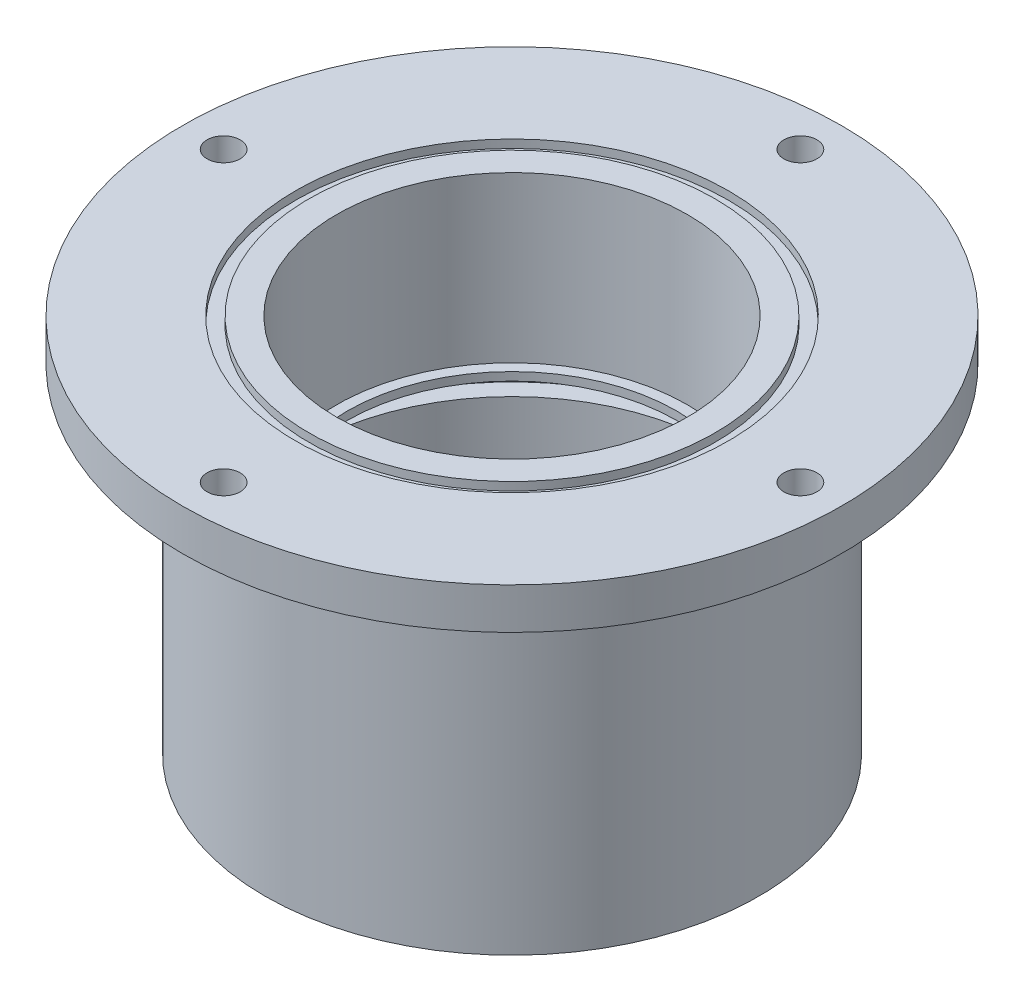
ISO-10303-21;
HEADER;
FILE_DESCRIPTION(('STEP AP214'),'2;1');
FILE_NAME('part.step','',(''),(''),'','','');
FILE_SCHEMA(('AUTOMOTIVE_DESIGN { 1 0 10303 214 1 1 1 1 }'));
ENDSEC;
DATA;
#1=APPLICATION_CONTEXT('core data for automotive mechanical design processes');
#2=APPLICATION_PROTOCOL_DEFINITION('international standard','automotive_design',2000,#1);
#3=PRODUCT_CONTEXT('',#1,'mechanical');
#4=PRODUCT('Part','Part','',(#3));
#5=PRODUCT_RELATED_PRODUCT_CATEGORY('part','',(#4));
#6=PRODUCT_DEFINITION_FORMATION('','',#4);
#7=PRODUCT_DEFINITION_CONTEXT('part definition',#1,'design');
#8=PRODUCT_DEFINITION('design','',#6,#7);
#9=PRODUCT_DEFINITION_SHAPE('','',#8);
#10=(LENGTH_UNIT() NAMED_UNIT(*) SI_UNIT(.MILLI.,.METRE.));
#11=(NAMED_UNIT(*) PLANE_ANGLE_UNIT() SI_UNIT($,.RADIAN.));
#12=(NAMED_UNIT(*) SI_UNIT($,.STERADIAN.) SOLID_ANGLE_UNIT());
#13=UNCERTAINTY_MEASURE_WITH_UNIT(LENGTH_MEASURE(1.E-05),#10,'distance_accuracy_value','');
#14=(GEOMETRIC_REPRESENTATION_CONTEXT(3) GLOBAL_UNCERTAINTY_ASSIGNED_CONTEXT((#13)) GLOBAL_UNIT_ASSIGNED_CONTEXT((#10,
#11,#12)) REPRESENTATION_CONTEXT('',''));
#15=CARTESIAN_POINT('',(0.,0.,0.));
#16=DIRECTION('',(0.,0.,1.));
#17=DIRECTION('',(1.,0.,0.));
#18=AXIS2_PLACEMENT_3D('',#15,#16,#17);
#19=CARTESIAN_POINT('',(0.,0.,0.));
#20=DIRECTION('',(0.,-1.,0.));
#21=DIRECTION('',(0.,0.,-1.));
#22=AXIS2_PLACEMENT_3D('',#19,#20,#21);
#23=CYLINDRICAL_SURFACE('',#22,38.1);
#24=CARTESIAN_POINT('',(0.,52.07,0.));
#25=DIRECTION('',(0.,-1.,0.));
#26=DIRECTION('',(0.,0.,-1.));
#27=AXIS2_PLACEMENT_3D('',#24,#25,#26);
#28=CIRCLE('',#27,38.1);
#29=CARTESIAN_POINT('',(0.,52.07,-38.1));
#30=VERTEX_POINT('',#29);
#31=EDGE_CURVE('E107',#30,#30,#28,.T.);
#32=ORIENTED_EDGE('',*,*,#31,.T.);
#33=EDGE_LOOP('',(#32));
#34=FACE_BOUND('',#33,.T.);
#35=CARTESIAN_POINT('',(0.,0.,0.));
#36=DIRECTION('',(0.,-1.,0.));
#37=DIRECTION('',(0.,0.,-1.));
#38=AXIS2_PLACEMENT_3D('',#35,#36,#37);
#39=CIRCLE('',#38,38.1);
#40=CARTESIAN_POINT('',(0.,0.,-38.1));
#41=VERTEX_POINT('',#40);
#42=EDGE_CURVE('E10',#41,#41,#39,.T.);
#43=ORIENTED_EDGE('',*,*,#42,.F.);
#44=EDGE_LOOP('',(#43));
#45=FACE_BOUND('',#44,.T.);
#46=ADVANCED_FACE('F37',(#34,#45),#23,.T.);
#47=CARTESIAN_POINT('',(31.8135,0.,0.));
#48=DIRECTION('',(0.,-1.,0.));
#49=DIRECTION('',(0.,0.,-1.));
#50=AXIS2_PLACEMENT_3D('',#47,#48,#49);
#51=PLANE('',#50);
#52=ORIENTED_EDGE('',*,*,#42,.T.);
#53=EDGE_LOOP('',(#52));
#54=FACE_BOUND('',#53,.T.);
#55=CARTESIAN_POINT('',(0.,0.,0.));
#56=DIRECTION('',(0.,-1.,0.));
#57=DIRECTION('',(0.,0.,-1.));
#58=AXIS2_PLACEMENT_3D('',#55,#56,#57);
#59=CIRCLE('',#58,31.8135);
#60=CARTESIAN_POINT('',(0.,0.,-31.8135));
#61=VERTEX_POINT('',#60);
#62=EDGE_CURVE('E43',#61,#61,#59,.T.);
#63=ORIENTED_EDGE('',*,*,#62,.F.);
#64=EDGE_LOOP('',(#63));
#65=FACE_BOUND('',#64,.T.);
#66=ADVANCED_FACE('F169',(#54,#65),#51,.T.);
#67=CARTESIAN_POINT('',(0.,0.,0.));
#68=DIRECTION('',(0.,-1.,0.));
#69=DIRECTION('',(0.,0.,-1.));
#70=AXIS2_PLACEMENT_3D('',#67,#68,#69);
#71=CYLINDRICAL_SURFACE('',#70,31.8135);
#72=ORIENTED_EDGE('',*,*,#62,.T.);
#73=EDGE_LOOP('',(#72));
#74=FACE_BOUND('',#73,.T.);
#75=CARTESIAN_POINT('',(0.,2.54,0.));
#76=DIRECTION('',(0.,-1.,0.));
#77=DIRECTION('',(0.,0.,-1.));
#78=AXIS2_PLACEMENT_3D('',#75,#76,#77);
#79=CIRCLE('',#78,31.8135);
#80=CARTESIAN_POINT('',(0.,2.54,-31.8135));
#81=VERTEX_POINT('',#80);
#82=EDGE_CURVE('E47',#81,#81,#79,.T.);
#83=ORIENTED_EDGE('',*,*,#82,.F.);
#84=EDGE_LOOP('',(#83));
#85=FACE_BOUND('',#84,.T.);
#86=ADVANCED_FACE('F173',(#74,#85),#71,.F.);
#87=CARTESIAN_POINT('',(31.8135,2.54,0.));
#88=DIRECTION('',(0.,1.,0.));
#89=DIRECTION('',(0.,0.,1.));
#90=AXIS2_PLACEMENT_3D('',#87,#88,#89);
#91=PLANE('',#90);
#92=ORIENTED_EDGE('',*,*,#82,.T.);
#93=EDGE_LOOP('',(#92));
#94=FACE_BOUND('',#93,.T.);
#95=CARTESIAN_POINT('',(0.,2.54,0.));
#96=DIRECTION('',(0.,-1.,0.));
#97=DIRECTION('',(0.,0.,-1.));
#98=AXIS2_PLACEMENT_3D('',#95,#96,#97);
#99=CIRCLE('',#98,33.909);
#100=CARTESIAN_POINT('',(0.,2.54,-33.909));
#101=VERTEX_POINT('',#100);
#102=EDGE_CURVE('E51',#101,#101,#99,.T.);
#103=ORIENTED_EDGE('',*,*,#102,.F.);
#104=EDGE_LOOP('',(#103));
#105=FACE_BOUND('',#104,.T.);
#106=ADVANCED_FACE('F177',(#94,#105),#91,.T.);
#107=CARTESIAN_POINT('',(0.,0.,0.));
#108=DIRECTION('',(0.,-1.,0.));
#109=DIRECTION('',(0.,0.,-1.));
#110=AXIS2_PLACEMENT_3D('',#107,#108,#109);
#111=CYLINDRICAL_SURFACE('',#110,33.909);
#112=ORIENTED_EDGE('',*,*,#102,.T.);
#113=EDGE_LOOP('',(#112));
#114=FACE_BOUND('',#113,.T.);
#115=CARTESIAN_POINT('',(0.,6.096,0.));
#116=DIRECTION('',(0.,-1.,0.));
#117=DIRECTION('',(0.,0.,-1.));
#118=AXIS2_PLACEMENT_3D('',#115,#116,#117);
#119=CIRCLE('',#118,33.909);
#120=CARTESIAN_POINT('',(0.,6.096,-33.909));
#121=VERTEX_POINT('',#120);
#122=EDGE_CURVE('E56',#121,#121,#119,.T.);
#123=ORIENTED_EDGE('',*,*,#122,.F.);
#124=EDGE_LOOP('',(#123));
#125=FACE_BOUND('',#124,.T.);
#126=ADVANCED_FACE('F183',(#114,#125),#111,.F.);
#127=CARTESIAN_POINT('',(33.909,6.096,0.));
#128=DIRECTION('',(0.,-1.,0.));
#129=DIRECTION('',(0.,0.,-1.));
#130=AXIS2_PLACEMENT_3D('',#127,#128,#129);
#131=PLANE('',#130);
#132=ORIENTED_EDGE('',*,*,#122,.T.);
#133=EDGE_LOOP('',(#132));
#134=FACE_BOUND('',#133,.T.);
#135=CARTESIAN_POINT('',(0.,6.096,0.));
#136=DIRECTION('',(0.,-1.,0.));
#137=DIRECTION('',(0.,0.,-1.));
#138=AXIS2_PLACEMENT_3D('',#135,#136,#137);
#139=CIRCLE('',#138,31.8135);
#140=CARTESIAN_POINT('',(0.,6.096,-31.8135));
#141=VERTEX_POINT('',#140);
#142=EDGE_CURVE('E59',#141,#141,#139,.T.);
#143=ORIENTED_EDGE('',*,*,#142,.F.);
#144=EDGE_LOOP('',(#143));
#145=FACE_BOUND('',#144,.T.);
#146=ADVANCED_FACE('F187',(#134,#145),#131,.T.);
#147=CARTESIAN_POINT('',(0.,0.,0.));
#148=DIRECTION('',(0.,-1.,0.));
#149=DIRECTION('',(0.,0.,-1.));
#150=AXIS2_PLACEMENT_3D('',#147,#148,#149);
#151=CYLINDRICAL_SURFACE('',#150,31.8135);
#152=ORIENTED_EDGE('',*,*,#142,.T.);
#153=EDGE_LOOP('',(#152));
#154=FACE_BOUND('',#153,.T.);
#155=CARTESIAN_POINT('',(0.,25.146,0.));
#156=DIRECTION('',(0.,-1.,0.));
#157=DIRECTION('',(0.,0.,-1.));
#158=AXIS2_PLACEMENT_3D('',#155,#156,#157);
#159=CIRCLE('',#158,31.8135);
#160=CARTESIAN_POINT('',(0.,25.146,-31.8135));
#161=VERTEX_POINT('',#160);
#162=EDGE_CURVE('E62',#161,#161,#159,.T.);
#163=ORIENTED_EDGE('',*,*,#162,.F.);
#164=EDGE_LOOP('',(#163));
#165=FACE_BOUND('',#164,.T.);
#166=ADVANCED_FACE('F191',(#154,#165),#151,.F.);
#167=CARTESIAN_POINT('',(31.8135,25.146,0.));
#168=DIRECTION('',(0.,1.,0.));
#169=DIRECTION('',(0.,0.,1.));
#170=AXIS2_PLACEMENT_3D('',#167,#168,#169);
#171=PLANE('',#170);
#172=ORIENTED_EDGE('',*,*,#162,.T.);
#173=EDGE_LOOP('',(#172));
#174=FACE_BOUND('',#173,.T.);
#175=CARTESIAN_POINT('',(0.,25.146,0.));
#176=DIRECTION('',(0.,-1.,0.));
#177=DIRECTION('',(0.,0.,-1.));
#178=AXIS2_PLACEMENT_3D('',#175,#176,#177);
#179=CIRCLE('',#178,34.5829759866241);
#180=CARTESIAN_POINT('',(0.,25.146,-34.5829759866241));
#181=VERTEX_POINT('',#180);
#182=EDGE_CURVE('E65',#181,#181,#179,.T.);
#183=ORIENTED_EDGE('',*,*,#182,.F.);
#184=EDGE_LOOP('',(#183));
#185=FACE_BOUND('',#184,.T.);
#186=ADVANCED_FACE('F195',(#174,#185),#171,.T.);
#187=CARTESIAN_POINT('',(0.,0.,0.));
#188=DIRECTION('',(0.,-1.,0.));
#189=DIRECTION('',(0.,0.,-1.));
#190=AXIS2_PLACEMENT_3D('',#187,#188,#189);
#191=CYLINDRICAL_SURFACE('',#190,34.5829759866241);
#192=ORIENTED_EDGE('',*,*,#182,.T.);
#193=EDGE_LOOP('',(#192));
#194=FACE_BOUND('',#193,.T.);
#195=CARTESIAN_POINT('',(0.,28.702,0.));
#196=DIRECTION('',(0.,-1.,0.));
#197=DIRECTION('',(0.,0.,-1.));
#198=AXIS2_PLACEMENT_3D('',#195,#196,#197);
#199=CIRCLE('',#198,34.5829759866241);
#200=CARTESIAN_POINT('',(0.,28.702,-34.5829759866241));
#201=VERTEX_POINT('',#200);
#202=EDGE_CURVE('E68',#201,#201,#199,.T.);
#203=ORIENTED_EDGE('',*,*,#202,.F.);
#204=EDGE_LOOP('',(#203));
#205=FACE_BOUND('',#204,.T.);
#206=ADVANCED_FACE('F199',(#194,#205),#191,.F.);
#207=CARTESIAN_POINT('',(34.5829759866241,28.702,0.));
#208=DIRECTION('',(0.,-1.,0.));
#209=DIRECTION('',(0.,0.,-1.));
#210=AXIS2_PLACEMENT_3D('',#207,#208,#209);
#211=PLANE('',#210);
#212=ORIENTED_EDGE('',*,*,#202,.T.);
#213=EDGE_LOOP('',(#212));
#214=FACE_BOUND('',#213,.T.);
#215=CARTESIAN_POINT('',(0.,28.702,0.));
#216=DIRECTION('',(0.,-1.,0.));
#217=DIRECTION('',(0.,0.,-1.));
#218=AXIS2_PLACEMENT_3D('',#215,#216,#217);
#219=CIRCLE('',#218,31.8135);
#220=CARTESIAN_POINT('',(0.,28.702,-31.8135));
#221=VERTEX_POINT('',#220);
#222=EDGE_CURVE('E71',#221,#221,#219,.T.);
#223=ORIENTED_EDGE('',*,*,#222,.F.);
#224=EDGE_LOOP('',(#223));
#225=FACE_BOUND('',#224,.T.);
#226=ADVANCED_FACE('F203',(#214,#225),#211,.T.);
#227=CARTESIAN_POINT('',(0.,0.,0.));
#228=DIRECTION('',(0.,-1.,0.));
#229=DIRECTION('',(0.,0.,-1.));
#230=AXIS2_PLACEMENT_3D('',#227,#228,#229);
#231=CYLINDRICAL_SURFACE('',#230,31.8135);
#232=ORIENTED_EDGE('',*,*,#222,.T.);
#233=EDGE_LOOP('',(#232));
#234=FACE_BOUND('',#233,.T.);
#235=CARTESIAN_POINT('',(0.,31.75,0.));
#236=DIRECTION('',(0.,-1.,0.));
#237=DIRECTION('',(0.,0.,-1.));
#238=AXIS2_PLACEMENT_3D('',#235,#236,#237);
#239=CIRCLE('',#238,31.8135);
#240=CARTESIAN_POINT('',(0.,31.75,-31.8135));
#241=VERTEX_POINT('',#240);
#242=EDGE_CURVE('E74',#241,#241,#239,.T.);
#243=ORIENTED_EDGE('',*,*,#242,.F.);
#244=EDGE_LOOP('',(#243));
#245=FACE_BOUND('',#244,.T.);
#246=ADVANCED_FACE('F207',(#234,#245),#231,.F.);
#247=CARTESIAN_POINT('',(25.4,31.75,0.));
#248=DIRECTION('',(0.,-1.,0.));
#249=DIRECTION('',(0.,0.,-1.));
#250=AXIS2_PLACEMENT_3D('',#247,#248,#249);
#251=PLANE('',#250);
#252=ORIENTED_EDGE('',*,*,#242,.T.);
#253=EDGE_LOOP('',(#252));
#254=FACE_BOUND('',#253,.T.);
#255=CARTESIAN_POINT('',(0.,31.75,0.));
#256=DIRECTION('',(0.,-1.,0.));
#257=DIRECTION('',(0.,0.,-1.));
#258=AXIS2_PLACEMENT_3D('',#255,#256,#257);
#259=CIRCLE('',#258,25.4);
#260=CARTESIAN_POINT('',(0.,31.75,-25.4));
#261=VERTEX_POINT('',#260);
#262=EDGE_CURVE('E77',#261,#261,#259,.T.);
#263=ORIENTED_EDGE('',*,*,#262,.F.);
#264=EDGE_LOOP('',(#263));
#265=FACE_BOUND('',#264,.T.);
#266=ADVANCED_FACE('F211',(#254,#265),#251,.T.);
#267=CARTESIAN_POINT('',(0.,0.,0.));
#268=DIRECTION('',(0.,-1.,0.));
#269=DIRECTION('',(0.,0.,-1.));
#270=AXIS2_PLACEMENT_3D('',#267,#268,#269);
#271=CYLINDRICAL_SURFACE('',#270,25.4);
#272=ORIENTED_EDGE('',*,*,#262,.T.);
#273=EDGE_LOOP('',(#272));
#274=FACE_BOUND('',#273,.T.);
#275=CARTESIAN_POINT('',(0.,33.02,0.));
#276=DIRECTION('',(0.,-1.,0.));
#277=DIRECTION('',(0.,0.,-1.));
#278=AXIS2_PLACEMENT_3D('',#275,#276,#277);
#279=CIRCLE('',#278,25.4);
#280=CARTESIAN_POINT('',(0.,33.02,-25.4));
#281=VERTEX_POINT('',#280);
#282=EDGE_CURVE('E80',#281,#281,#279,.T.);
#283=ORIENTED_EDGE('',*,*,#282,.F.);
#284=EDGE_LOOP('',(#283));
#285=FACE_BOUND('',#284,.T.);
#286=ADVANCED_FACE('F215',(#274,#285),#271,.F.);
#287=CARTESIAN_POINT('',(25.4,33.02,0.));
#288=DIRECTION('',(0.,1.,0.));
#289=DIRECTION('',(0.,0.,1.));
#290=AXIS2_PLACEMENT_3D('',#287,#288,#289);
#291=PLANE('',#290);
#292=ORIENTED_EDGE('',*,*,#282,.T.);
#293=EDGE_LOOP('',(#292));
#294=FACE_BOUND('',#293,.T.);
#295=CARTESIAN_POINT('',(0.,33.02,0.));
#296=DIRECTION('',(0.,-1.,0.));
#297=DIRECTION('',(0.,0.,-1.));
#298=AXIS2_PLACEMENT_3D('',#295,#296,#297);
#299=CIRCLE('',#298,27.051);
#300=CARTESIAN_POINT('',(0.,33.02,-27.051));
#301=VERTEX_POINT('',#300);
#302=EDGE_CURVE('E83',#301,#301,#299,.T.);
#303=ORIENTED_EDGE('',*,*,#302,.F.);
#304=EDGE_LOOP('',(#303));
#305=FACE_BOUND('',#304,.T.);
#306=ADVANCED_FACE('F219',(#294,#305),#291,.T.);
#307=CARTESIAN_POINT('',(0.,0.,0.));
#308=DIRECTION('',(0.,-1.,0.));
#309=DIRECTION('',(0.,0.,-1.));
#310=AXIS2_PLACEMENT_3D('',#307,#308,#309);
#311=CYLINDRICAL_SURFACE('',#310,27.051);
#312=ORIENTED_EDGE('',*,*,#302,.T.);
#313=EDGE_LOOP('',(#312));
#314=FACE_BOUND('',#313,.T.);
#315=CARTESIAN_POINT('',(0.,58.42,0.));
#316=DIRECTION('',(0.,-1.,0.));
#317=DIRECTION('',(0.,0.,-1.));
#318=AXIS2_PLACEMENT_3D('',#315,#316,#317);
#319=CIRCLE('',#318,27.051);
#320=CARTESIAN_POINT('',(0.,58.42,-27.051));
#321=VERTEX_POINT('',#320);
#322=EDGE_CURVE('E86',#321,#321,#319,.T.);
#323=ORIENTED_EDGE('',*,*,#322,.F.);
#324=EDGE_LOOP('',(#323));
#325=FACE_BOUND('',#324,.T.);
#326=ADVANCED_FACE('F223',(#314,#325),#311,.F.);
#327=CARTESIAN_POINT('',(27.051,58.42,0.));
#328=DIRECTION('',(0.,1.,0.));
#329=DIRECTION('',(0.,0.,1.));
#330=AXIS2_PLACEMENT_3D('',#327,#328,#329);
#331=PLANE('',#330);
#332=ORIENTED_EDGE('',*,*,#322,.T.);
#333=EDGE_LOOP('',(#332));
#334=FACE_BOUND('',#333,.T.);
#335=CARTESIAN_POINT('',(0.,58.42,0.));
#336=DIRECTION('',(0.,-1.,0.));
#337=DIRECTION('',(0.,0.,-1.));
#338=AXIS2_PLACEMENT_3D('',#335,#336,#337);
#339=CIRCLE('',#338,31.2801);
#340=CARTESIAN_POINT('',(0.,58.42,-31.2801));
#341=VERTEX_POINT('',#340);
#342=EDGE_CURVE('E89',#341,#341,#339,.T.);
#343=ORIENTED_EDGE('',*,*,#342,.F.);
#344=EDGE_LOOP('',(#343));
#345=FACE_BOUND('',#344,.T.);
#346=ADVANCED_FACE('F227',(#334,#345),#331,.T.);
#347=CARTESIAN_POINT('',(0.,0.,0.));
#348=DIRECTION('',(0.,-1.,0.));
#349=DIRECTION('',(0.,0.,-1.));
#350=AXIS2_PLACEMENT_3D('',#347,#348,#349);
#351=CYLINDRICAL_SURFACE('',#350,31.2801);
#352=ORIENTED_EDGE('',*,*,#342,.T.);
#353=EDGE_LOOP('',(#352));
#354=FACE_BOUND('',#353,.T.);
#355=CARTESIAN_POINT('',(0.,57.15,0.));
#356=DIRECTION('',(0.,-1.,0.));
#357=DIRECTION('',(0.,0.,-1.));
#358=AXIS2_PLACEMENT_3D('',#355,#356,#357);
#359=CIRCLE('',#358,31.2801);
#360=CARTESIAN_POINT('',(0.,57.15,-31.2801));
#361=VERTEX_POINT('',#360);
#362=EDGE_CURVE('E92',#361,#361,#359,.T.);
#363=ORIENTED_EDGE('',*,*,#362,.F.);
#364=EDGE_LOOP('',(#363));
#365=FACE_BOUND('',#364,.T.);
#366=ADVANCED_FACE('F231',(#354,#365),#351,.T.);
#367=CARTESIAN_POINT('',(31.2801,57.15,0.));
#368=DIRECTION('',(0.,1.,0.));
#369=DIRECTION('',(0.,0.,1.));
#370=AXIS2_PLACEMENT_3D('',#367,#368,#369);
#371=PLANE('',#370);
#372=ORIENTED_EDGE('',*,*,#362,.T.);
#373=EDGE_LOOP('',(#372));
#374=FACE_BOUND('',#373,.T.);
#375=CARTESIAN_POINT('',(0.,57.15,0.));
#376=DIRECTION('',(0.,-1.,0.));
#377=DIRECTION('',(0.,0.,-1.));
#378=AXIS2_PLACEMENT_3D('',#375,#376,#377);
#379=CIRCLE('',#378,33.3883);
#380=CARTESIAN_POINT('',(0.,57.15,-33.3883));
#381=VERTEX_POINT('',#380);
#382=EDGE_CURVE('E95',#381,#381,#379,.T.);
#383=ORIENTED_EDGE('',*,*,#382,.F.);
#384=EDGE_LOOP('',(#383));
#385=FACE_BOUND('',#384,.T.);
#386=ADVANCED_FACE('F235',(#374,#385),#371,.T.);
#387=CARTESIAN_POINT('',(0.,0.,0.));
#388=DIRECTION('',(0.,-1.,0.));
#389=DIRECTION('',(0.,0.,-1.));
#390=AXIS2_PLACEMENT_3D('',#387,#388,#389);
#391=CYLINDRICAL_SURFACE('',#390,33.3883);
#392=ORIENTED_EDGE('',*,*,#382,.T.);
#393=EDGE_LOOP('',(#392));
#394=FACE_BOUND('',#393,.T.);
#395=CARTESIAN_POINT('',(0.,58.42,0.));
#396=DIRECTION('',(0.,-1.,0.));
#397=DIRECTION('',(0.,0.,-1.));
#398=AXIS2_PLACEMENT_3D('',#395,#396,#397);
#399=CIRCLE('',#398,33.3883);
#400=CARTESIAN_POINT('',(0.,58.42,-33.3883));
#401=VERTEX_POINT('',#400);
#402=EDGE_CURVE('E98',#401,#401,#399,.T.);
#403=ORIENTED_EDGE('',*,*,#402,.F.);
#404=EDGE_LOOP('',(#403));
#405=FACE_BOUND('',#404,.T.);
#406=ADVANCED_FACE('F142',(#394,#405),#391,.F.);
#407=CARTESIAN_POINT('',(33.3883,58.42,0.));
#408=DIRECTION('',(0.,1.,0.));
#409=DIRECTION('',(0.,0.,1.));
#410=AXIS2_PLACEMENT_3D('',#407,#408,#409);
#411=PLANE('',#410);
#412=CARTESIAN_POINT('',(-44.45,58.42,-4.65589036534732E-13));
#413=DIRECTION('',(0.,1.,0.));
#414=DIRECTION('',(0.,0.,1.));
#415=AXIS2_PLACEMENT_3D('',#412,#413,#414);
#416=CIRCLE('',#415,2.5527);
#417=CARTESIAN_POINT('',(-44.45,58.42,2.55269999999953));
#418=VERTEX_POINT('',#417);
#419=EDGE_CURVE('E131',#418,#418,#416,.T.);
#420=ORIENTED_EDGE('',*,*,#419,.F.);
#421=EDGE_LOOP('',(#420));
#422=FACE_BOUND('',#421,.T.);
#423=CARTESIAN_POINT('',(0.,58.42,44.45));
#424=DIRECTION('',(0.,1.,0.));
#425=DIRECTION('',(0.,0.,1.));
#426=AXIS2_PLACEMENT_3D('',#423,#424,#425);
#427=CIRCLE('',#426,2.5527);
#428=CARTESIAN_POINT('',(0.,58.42,47.0027));
#429=VERTEX_POINT('',#428);
#430=EDGE_CURVE('E125',#429,#429,#427,.T.);
#431=ORIENTED_EDGE('',*,*,#430,.F.);
#432=EDGE_LOOP('',(#431));
#433=FACE_BOUND('',#432,.T.);
#434=CARTESIAN_POINT('',(44.45,58.42,1.55196345511577E-13));
#435=DIRECTION('',(0.,1.,0.));
#436=DIRECTION('',(0.,0.,1.));
#437=AXIS2_PLACEMENT_3D('',#434,#435,#436);
#438=CIRCLE('',#437,2.5527);
#439=CARTESIAN_POINT('',(44.45,58.42,2.55270000000015));
#440=VERTEX_POINT('',#439);
#441=EDGE_CURVE('E119',#440,#440,#438,.T.);
#442=ORIENTED_EDGE('',*,*,#441,.F.);
#443=EDGE_LOOP('',(#442));
#444=FACE_BOUND('',#443,.T.);
#445=CARTESIAN_POINT('',(0.,58.42,-44.45));
#446=DIRECTION('',(0.,1.,0.));
#447=DIRECTION('',(0.,0.,1.));
#448=AXIS2_PLACEMENT_3D('',#445,#446,#447);
#449=CIRCLE('',#448,2.5527);
#450=CARTESIAN_POINT('',(0.,58.42,-41.8973));
#451=VERTEX_POINT('',#450);
#452=EDGE_CURVE('E113',#451,#451,#449,.T.);
#453=ORIENTED_EDGE('',*,*,#452,.F.);
#454=EDGE_LOOP('',(#453));
#455=FACE_BOUND('',#454,.T.);
#456=ORIENTED_EDGE('',*,*,#402,.T.);
#457=EDGE_LOOP('',(#456));
#458=FACE_BOUND('',#457,.T.);
#459=CARTESIAN_POINT('',(0.,58.42,0.));
#460=DIRECTION('',(0.,-1.,0.));
#461=DIRECTION('',(0.,0.,-1.));
#462=AXIS2_PLACEMENT_3D('',#459,#460,#461);
#463=CIRCLE('',#462,50.8);
#464=CARTESIAN_POINT('',(0.,58.42,-50.8));
#465=VERTEX_POINT('',#464);
#466=EDGE_CURVE('E101',#465,#465,#463,.T.);
#467=ORIENTED_EDGE('',*,*,#466,.F.);
#468=EDGE_LOOP('',(#467));
#469=FACE_BOUND('',#468,.T.);
#470=ADVANCED_FACE('F138',(#422,#433,#444,#455,#458,#469),#411,.T.);
#471=CARTESIAN_POINT('',(0.,0.,0.));
#472=DIRECTION('',(0.,-1.,0.));
#473=DIRECTION('',(0.,0.,-1.));
#474=AXIS2_PLACEMENT_3D('',#471,#472,#473);
#475=CYLINDRICAL_SURFACE('',#474,50.8);
#476=ORIENTED_EDGE('',*,*,#466,.T.);
#477=EDGE_LOOP('',(#476));
#478=FACE_BOUND('',#477,.T.);
#479=CARTESIAN_POINT('',(0.,52.07,0.));
#480=DIRECTION('',(0.,-1.,0.));
#481=DIRECTION('',(0.,0.,-1.));
#482=AXIS2_PLACEMENT_3D('',#479,#480,#481);
#483=CIRCLE('',#482,50.8);
#484=CARTESIAN_POINT('',(0.,52.07,-50.8));
#485=VERTEX_POINT('',#484);
#486=EDGE_CURVE('E104',#485,#485,#483,.T.);
#487=ORIENTED_EDGE('',*,*,#486,.F.);
#488=EDGE_LOOP('',(#487));
#489=FACE_BOUND('',#488,.T.);
#490=ADVANCED_FACE('F141',(#478,#489),#475,.T.);
#491=CARTESIAN_POINT('',(38.1,52.07,0.));
#492=DIRECTION('',(0.,-1.,0.));
#493=DIRECTION('',(0.,0.,-1.));
#494=AXIS2_PLACEMENT_3D('',#491,#492,#493);
#495=PLANE('',#494);
#496=CARTESIAN_POINT('',(-44.45,52.07,-4.65589036534732E-13));
#497=DIRECTION('',(0.,-1.,0.));
#498=DIRECTION('',(0.,0.,-1.));
#499=AXIS2_PLACEMENT_3D('',#496,#497,#498);
#500=CIRCLE('',#499,2.5527);
#501=CARTESIAN_POINT('',(-44.45,52.07,-2.55270000000046));
#502=VERTEX_POINT('',#501);
#503=EDGE_CURVE('E128',#502,#502,#500,.T.);
#504=ORIENTED_EDGE('',*,*,#503,.F.);
#505=EDGE_LOOP('',(#504));
#506=FACE_BOUND('',#505,.T.);
#507=CARTESIAN_POINT('',(0.,52.07,44.45));
#508=DIRECTION('',(0.,-1.,0.));
#509=DIRECTION('',(0.,0.,-1.));
#510=AXIS2_PLACEMENT_3D('',#507,#508,#509);
#511=CIRCLE('',#510,2.5527);
#512=CARTESIAN_POINT('',(0.,52.07,41.8973));
#513=VERTEX_POINT('',#512);
#514=EDGE_CURVE('E122',#513,#513,#511,.T.);
#515=ORIENTED_EDGE('',*,*,#514,.F.);
#516=EDGE_LOOP('',(#515));
#517=FACE_BOUND('',#516,.T.);
#518=CARTESIAN_POINT('',(44.45,52.07,1.55196345511577E-13));
#519=DIRECTION('',(0.,-1.,0.));
#520=DIRECTION('',(0.,0.,-1.));
#521=AXIS2_PLACEMENT_3D('',#518,#519,#520);
#522=CIRCLE('',#521,2.5527);
#523=CARTESIAN_POINT('',(44.45,52.07,-2.55269999999984));
#524=VERTEX_POINT('',#523);
#525=EDGE_CURVE('E116',#524,#524,#522,.T.);
#526=ORIENTED_EDGE('',*,*,#525,.F.);
#527=EDGE_LOOP('',(#526));
#528=FACE_BOUND('',#527,.T.);
#529=CARTESIAN_POINT('',(0.,52.07,-44.45));
#530=DIRECTION('',(0.,-1.,0.));
#531=DIRECTION('',(0.,0.,-1.));
#532=AXIS2_PLACEMENT_3D('',#529,#530,#531);
#533=CIRCLE('',#532,2.5527);
#534=CARTESIAN_POINT('',(0.,52.07,-47.0027));
#535=VERTEX_POINT('',#534);
#536=EDGE_CURVE('E110',#535,#535,#533,.T.);
#537=ORIENTED_EDGE('',*,*,#536,.F.);
#538=EDGE_LOOP('',(#537));
#539=FACE_BOUND('',#538,.T.);
#540=ORIENTED_EDGE('',*,*,#486,.T.);
#541=EDGE_LOOP('',(#540));
#542=FACE_BOUND('',#541,.T.);
#543=ORIENTED_EDGE('',*,*,#31,.F.);
#544=EDGE_LOOP('',(#543));
#545=FACE_BOUND('',#544,.T.);
#546=ADVANCED_FACE('F156',(#506,#517,#528,#539,#542,#545),#495,.T.);
#547=CARTESIAN_POINT('',(0.,58.42,-44.45));
#548=DIRECTION('',(0.,1.,0.));
#549=DIRECTION('',(0.,0.,1.));
#550=AXIS2_PLACEMENT_3D('',#547,#548,#549);
#551=CYLINDRICAL_SURFACE('',#550,2.5527);
#552=ORIENTED_EDGE('',*,*,#452,.T.);
#553=EDGE_LOOP('',(#552));
#554=FACE_BOUND('',#553,.T.);
#555=ORIENTED_EDGE('',*,*,#536,.T.);
#556=EDGE_LOOP('',(#555));
#557=FACE_BOUND('',#556,.T.);
#558=ADVANCED_FACE('F162',(#554,#557),#551,.F.);
#559=CARTESIAN_POINT('',(44.45,58.42,1.55196345511577E-13));
#560=DIRECTION('',(0.,1.,0.));
#561=DIRECTION('',(0.,0.,1.));
#562=AXIS2_PLACEMENT_3D('',#559,#560,#561);
#563=CYLINDRICAL_SURFACE('',#562,2.5527);
#564=ORIENTED_EDGE('',*,*,#441,.T.);
#565=EDGE_LOOP('',(#564));
#566=FACE_BOUND('',#565,.T.);
#567=ORIENTED_EDGE('',*,*,#525,.T.);
#568=EDGE_LOOP('',(#567));
#569=FACE_BOUND('',#568,.T.);
#570=ADVANCED_FACE('F245',(#566,#569),#563,.F.);
#571=CARTESIAN_POINT('',(0.,58.42,44.45));
#572=DIRECTION('',(0.,1.,0.));
#573=DIRECTION('',(0.,0.,1.));
#574=AXIS2_PLACEMENT_3D('',#571,#572,#573);
#575=CYLINDRICAL_SURFACE('',#574,2.5527);
#576=ORIENTED_EDGE('',*,*,#430,.T.);
#577=EDGE_LOOP('',(#576));
#578=FACE_BOUND('',#577,.T.);
#579=ORIENTED_EDGE('',*,*,#514,.T.);
#580=EDGE_LOOP('',(#579));
#581=FACE_BOUND('',#580,.T.);
#582=ADVANCED_FACE('F249',(#578,#581),#575,.F.);
#583=CARTESIAN_POINT('',(-44.45,58.42,-4.65589036534732E-13));
#584=DIRECTION('',(0.,1.,0.));
#585=DIRECTION('',(0.,0.,1.));
#586=AXIS2_PLACEMENT_3D('',#583,#584,#585);
#587=CYLINDRICAL_SURFACE('',#586,2.5527);
#588=ORIENTED_EDGE('',*,*,#419,.T.);
#589=EDGE_LOOP('',(#588));
#590=FACE_BOUND('',#589,.T.);
#591=ORIENTED_EDGE('',*,*,#503,.T.);
#592=EDGE_LOOP('',(#591));
#593=FACE_BOUND('',#592,.T.);
#594=ADVANCED_FACE('F135',(#590,#593),#587,.F.);
#595=CLOSED_SHELL('',(#46,#66,#86,#106,#126,#146,#166,#186,#206,#226,#246,#266,#286,#306,#326,
#346,#366,#386,#406,#470,#490,#546,#558,#570,#582,#594));
#596=MANIFOLD_SOLID_BREP('B2',#595);
#597=ADVANCED_BREP_SHAPE_REPRESENTATION('',(#18,#596),#14);
#598=SHAPE_DEFINITION_REPRESENTATION(#9,#597);
ENDSEC;
END-ISO-10303-21;
